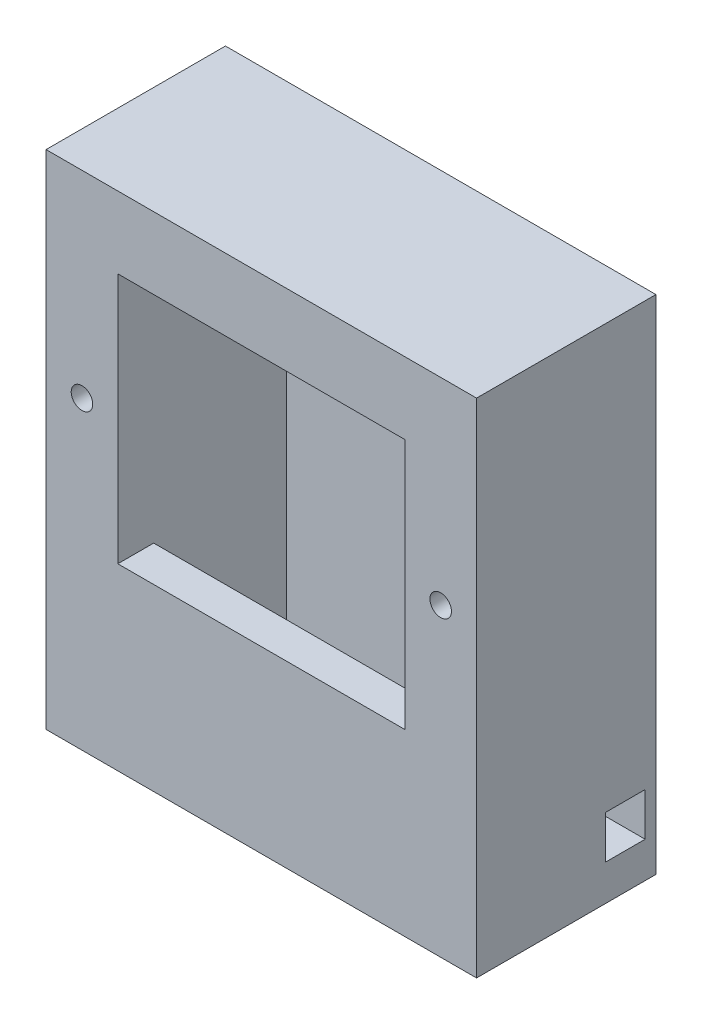
ISO-10303-21;
HEADER;
FILE_DESCRIPTION(('STEP AP214'),'2;1');
FILE_NAME('part.step','',(''),(''),'','','');
FILE_SCHEMA(('AUTOMOTIVE_DESIGN { 1 0 10303 214 1 1 1 1 }'));
ENDSEC;
DATA;
#1=APPLICATION_CONTEXT('core data for automotive mechanical design processes');
#2=APPLICATION_PROTOCOL_DEFINITION('international standard','automotive_design',2000,#1);
#3=PRODUCT_CONTEXT('',#1,'mechanical');
#4=PRODUCT('Part','Part','',(#3));
#5=PRODUCT_RELATED_PRODUCT_CATEGORY('part','',(#4));
#6=PRODUCT_DEFINITION_FORMATION('','',#4);
#7=PRODUCT_DEFINITION_CONTEXT('part definition',#1,'design');
#8=PRODUCT_DEFINITION('design','',#6,#7);
#9=PRODUCT_DEFINITION_SHAPE('','',#8);
#10=(LENGTH_UNIT() NAMED_UNIT(*) SI_UNIT(.MILLI.,.METRE.));
#11=(NAMED_UNIT(*) PLANE_ANGLE_UNIT() SI_UNIT($,.RADIAN.));
#12=(NAMED_UNIT(*) SI_UNIT($,.STERADIAN.) SOLID_ANGLE_UNIT());
#13=UNCERTAINTY_MEASURE_WITH_UNIT(LENGTH_MEASURE(1.E-05),#10,'distance_accuracy_value','');
#14=(GEOMETRIC_REPRESENTATION_CONTEXT(3) GLOBAL_UNCERTAINTY_ASSIGNED_CONTEXT((#13)) GLOBAL_UNIT_ASSIGNED_CONTEXT((#10,
#11,#12)) REPRESENTATION_CONTEXT('',''));
#15=CARTESIAN_POINT('',(0.,0.,0.));
#16=DIRECTION('',(0.,0.,1.));
#17=DIRECTION('',(1.,0.,0.));
#18=AXIS2_PLACEMENT_3D('',#15,#16,#17);
#19=CARTESIAN_POINT('',(0.,0.,50.));
#20=DIRECTION('',(-1.,0.,0.));
#21=DIRECTION('',(0.,-1.,0.));
#22=AXIS2_PLACEMENT_3D('',#19,#20,#21);
#23=PLANE('',#22);
#24=DIRECTION('',(0.,0.,-1.));
#25=VECTOR('',#24,1.);
#26=CARTESIAN_POINT('',(0.,-130.,14.));
#27=LINE('',#26,#25);
#28=CARTESIAN_POINT('',(0.,-130.,14.));
#29=VERTEX_POINT('',#28);
#30=CARTESIAN_POINT('',(0.,-130.,3.));
#31=VERTEX_POINT('',#30);
#32=EDGE_CURVE('E310',#29,#31,#27,.T.);
#33=ORIENTED_EDGE('',*,*,#32,.F.);
#34=DIRECTION('',(0.,-1.,0.));
#35=VECTOR('',#34,1.);
#36=CARTESIAN_POINT('',(0.,-118.,14.));
#37=LINE('',#36,#35);
#38=CARTESIAN_POINT('',(0.,-118.,14.));
#39=VERTEX_POINT('',#38);
#40=EDGE_CURVE('E49',#39,#29,#37,.T.);
#41=ORIENTED_EDGE('',*,*,#40,.F.);
#42=DIRECTION('',(0.,0.,1.));
#43=VECTOR('',#42,1.);
#44=CARTESIAN_POINT('',(0.,-118.,14.));
#45=LINE('',#44,#43);
#46=CARTESIAN_POINT('',(0.,-118.,3.));
#47=VERTEX_POINT('',#46);
#48=EDGE_CURVE('E147',#47,#39,#45,.T.);
#49=ORIENTED_EDGE('',*,*,#48,.F.);
#50=DIRECTION('',(0.,1.,0.));
#51=VECTOR('',#50,1.);
#52=CARTESIAN_POINT('',(0.,-118.,3.));
#53=LINE('',#52,#51);
#54=EDGE_CURVE('E308',#31,#47,#53,.T.);
#55=ORIENTED_EDGE('',*,*,#54,.F.);
#56=EDGE_LOOP('',(#33,#41,#49,#55));
#57=FACE_BOUND('',#56,.T.);
#58=DIRECTION('',(0.,1.,0.));
#59=VECTOR('',#58,1.);
#60=CARTESIAN_POINT('',(0.,0.,0.));
#61=LINE('',#60,#59);
#62=CARTESIAN_POINT('',(0.,-140.,0.));
#63=VERTEX_POINT('',#62);
#64=CARTESIAN_POINT('',(0.,0.,0.));
#65=VERTEX_POINT('',#64);
#66=EDGE_CURVE('E192',#63,#65,#61,.T.);
#67=ORIENTED_EDGE('',*,*,#66,.T.);
#68=DIRECTION('',(0.,0.,-1.));
#69=VECTOR('',#68,1.);
#70=CARTESIAN_POINT('',(0.,0.,50.));
#71=LINE('',#70,#69);
#72=CARTESIAN_POINT('',(0.,0.,50.));
#73=VERTEX_POINT('',#72);
#74=EDGE_CURVE('E11',#73,#65,#71,.T.);
#75=ORIENTED_EDGE('',*,*,#74,.F.);
#76=DIRECTION('',(0.,1.,0.));
#77=VECTOR('',#76,1.);
#78=CARTESIAN_POINT('',(0.,0.,50.));
#79=LINE('',#78,#77);
#80=CARTESIAN_POINT('',(0.,-140.,50.));
#81=VERTEX_POINT('',#80);
#82=EDGE_CURVE('E198',#81,#73,#79,.T.);
#83=ORIENTED_EDGE('',*,*,#82,.F.);
#84=DIRECTION('',(0.,0.,-1.));
#85=VECTOR('',#84,1.);
#86=CARTESIAN_POINT('',(0.,-140.,50.));
#87=LINE('',#86,#85);
#88=EDGE_CURVE('E208',#81,#63,#87,.T.);
#89=ORIENTED_EDGE('',*,*,#88,.T.);
#90=EDGE_LOOP('',(#67,#75,#83,#89));
#91=FACE_BOUND('',#90,.T.);
#92=ADVANCED_FACE('F35',(#57,#91),#23,.F.);
#93=CARTESIAN_POINT('',(0.,0.,50.));
#94=DIRECTION('',(0.,-1.,0.));
#95=DIRECTION('',(0.,0.,-1.));
#96=AXIS2_PLACEMENT_3D('',#93,#94,#95);
#97=PLANE('',#96);
#98=DIRECTION('',(-1.,0.,0.));
#99=VECTOR('',#98,1.);
#100=CARTESIAN_POINT('',(0.,0.,0.));
#101=LINE('',#100,#99);
#102=CARTESIAN_POINT('',(-120.,0.,0.));
#103=VERTEX_POINT('',#102);
#104=EDGE_CURVE('E211',#65,#103,#101,.T.);
#105=ORIENTED_EDGE('',*,*,#104,.T.);
#106=DIRECTION('',(0.,0.,-1.));
#107=VECTOR('',#106,1.);
#108=CARTESIAN_POINT('',(-120.,0.,50.));
#109=LINE('',#108,#107);
#110=CARTESIAN_POINT('',(-120.,0.,50.));
#111=VERTEX_POINT('',#110);
#112=EDGE_CURVE('E42',#111,#103,#109,.T.);
#113=ORIENTED_EDGE('',*,*,#112,.F.);
#114=DIRECTION('',(-1.,0.,0.));
#115=VECTOR('',#114,1.);
#116=CARTESIAN_POINT('',(0.,0.,50.));
#117=LINE('',#116,#115);
#118=EDGE_CURVE('E201',#73,#111,#117,.T.);
#119=ORIENTED_EDGE('',*,*,#118,.F.);
#120=ORIENTED_EDGE('',*,*,#74,.T.);
#121=EDGE_LOOP('',(#105,#113,#119,#120));
#122=FACE_BOUND('',#121,.T.);
#123=ADVANCED_FACE('F241',(#122),#97,.F.);
#124=CARTESIAN_POINT('',(-120.,0.,50.));
#125=DIRECTION('',(1.,0.,0.));
#126=DIRECTION('',(0.,1.,0.));
#127=AXIS2_PLACEMENT_3D('',#124,#125,#126);
#128=PLANE('',#127);
#129=DIRECTION('',(0.,-1.,0.));
#130=VECTOR('',#129,1.);
#131=CARTESIAN_POINT('',(-120.,0.,0.));
#132=LINE('',#131,#130);
#133=CARTESIAN_POINT('',(-120.,-140.,0.));
#134=VERTEX_POINT('',#133);
#135=EDGE_CURVE('E213',#103,#134,#132,.T.);
#136=ORIENTED_EDGE('',*,*,#135,.T.);
#137=DIRECTION('',(0.,0.,-1.));
#138=VECTOR('',#137,1.);
#139=CARTESIAN_POINT('',(-120.,-140.,50.));
#140=LINE('',#139,#138);
#141=CARTESIAN_POINT('',(-120.,-140.,50.));
#142=VERTEX_POINT('',#141);
#143=EDGE_CURVE('E218',#142,#134,#140,.T.);
#144=ORIENTED_EDGE('',*,*,#143,.F.);
#145=DIRECTION('',(0.,-1.,0.));
#146=VECTOR('',#145,1.);
#147=CARTESIAN_POINT('',(-120.,0.,50.));
#148=LINE('',#147,#146);
#149=EDGE_CURVE('E204',#111,#142,#148,.T.);
#150=ORIENTED_EDGE('',*,*,#149,.F.);
#151=ORIENTED_EDGE('',*,*,#112,.T.);
#152=EDGE_LOOP('',(#136,#144,#150,#151));
#153=FACE_BOUND('',#152,.T.);
#154=ADVANCED_FACE('F225',(#153),#128,.F.);
#155=CARTESIAN_POINT('',(0.,-140.,50.));
#156=DIRECTION('',(0.,1.,0.));
#157=DIRECTION('',(-1.,0.,0.));
#158=AXIS2_PLACEMENT_3D('',#155,#156,#157);
#159=PLANE('',#158);
#160=DIRECTION('',(1.,0.,0.));
#161=VECTOR('',#160,1.);
#162=CARTESIAN_POINT('',(0.,-140.,0.));
#163=LINE('',#162,#161);
#164=EDGE_CURVE('E202',#134,#63,#163,.T.);
#165=ORIENTED_EDGE('',*,*,#164,.T.);
#166=ORIENTED_EDGE('',*,*,#88,.F.);
#167=DIRECTION('',(1.,0.,0.));
#168=VECTOR('',#167,1.);
#169=CARTESIAN_POINT('',(0.,-140.,50.));
#170=LINE('',#169,#168);
#171=EDGE_CURVE('E206',#142,#81,#170,.T.);
#172=ORIENTED_EDGE('',*,*,#171,.F.);
#173=ORIENTED_EDGE('',*,*,#143,.T.);
#174=EDGE_LOOP('',(#165,#166,#172,#173));
#175=FACE_BOUND('',#174,.T.);
#176=ADVANCED_FACE('F234',(#175),#159,.F.);
#177=CARTESIAN_POINT('',(0.,0.,50.));
#178=DIRECTION('',(0.,0.,-1.));
#179=DIRECTION('',(-1.,0.,0.));
#180=AXIS2_PLACEMENT_3D('',#177,#178,#179);
#181=PLANE('',#180);
#182=CARTESIAN_POINT('',(-9.99999999999999,-55.,50.));
#183=DIRECTION('',(0.,0.,1.));
#184=DIRECTION('',(1.,0.,0.));
#185=AXIS2_PLACEMENT_3D('',#182,#183,#184);
#186=CIRCLE('',#185,3.);
#187=CARTESIAN_POINT('',(-6.99999999999998,-55.,50.));
#188=VERTEX_POINT('',#187);
#189=EDGE_CURVE('E153',#188,#188,#186,.T.);
#190=ORIENTED_EDGE('',*,*,#189,.F.);
#191=EDGE_LOOP('',(#190));
#192=FACE_BOUND('',#191,.T.);
#193=CARTESIAN_POINT('',(-110.,-55.,50.));
#194=DIRECTION('',(0.,0.,1.));
#195=DIRECTION('',(1.,0.,0.));
#196=AXIS2_PLACEMENT_3D('',#193,#194,#195);
#197=CIRCLE('',#196,3.00000000000001);
#198=CARTESIAN_POINT('',(-107.,-55.,50.));
#199=VERTEX_POINT('',#198);
#200=EDGE_CURVE('E169',#199,#199,#197,.T.);
#201=ORIENTED_EDGE('',*,*,#200,.F.);
#202=EDGE_LOOP('',(#201));
#203=FACE_BOUND('',#202,.T.);
#204=DIRECTION('',(1.,0.,0.));
#205=VECTOR('',#204,1.);
#206=CARTESIAN_POINT('',(-100.,-90.,50.));
#207=LINE('',#206,#205);
#208=CARTESIAN_POINT('',(-100.,-90.,50.));
#209=VERTEX_POINT('',#208);
#210=CARTESIAN_POINT('',(-20.,-90.,50.));
#211=VERTEX_POINT('',#210);
#212=EDGE_CURVE('E183',#209,#211,#207,.T.);
#213=ORIENTED_EDGE('',*,*,#212,.F.);
#214=DIRECTION('',(0.,-1.,0.));
#215=VECTOR('',#214,1.);
#216=CARTESIAN_POINT('',(-100.,-20.,50.));
#217=LINE('',#216,#215);
#218=CARTESIAN_POINT('',(-100.,-20.,50.));
#219=VERTEX_POINT('',#218);
#220=EDGE_CURVE('E168',#219,#209,#217,.T.);
#221=ORIENTED_EDGE('',*,*,#220,.F.);
#222=DIRECTION('',(-1.,0.,0.));
#223=VECTOR('',#222,1.);
#224=CARTESIAN_POINT('',(-100.,-20.,50.));
#225=LINE('',#224,#223);
#226=CARTESIAN_POINT('',(-20.,-20.,50.));
#227=VERTEX_POINT('',#226);
#228=EDGE_CURVE('E177',#227,#219,#225,.T.);
#229=ORIENTED_EDGE('',*,*,#228,.F.);
#230=DIRECTION('',(0.,1.,0.));
#231=VECTOR('',#230,1.);
#232=CARTESIAN_POINT('',(-20.,-20.,50.));
#233=LINE('',#232,#231);
#234=EDGE_CURVE('E185',#211,#227,#233,.T.);
#235=ORIENTED_EDGE('',*,*,#234,.F.);
#236=EDGE_LOOP('',(#213,#221,#229,#235));
#237=FACE_BOUND('',#236,.T.);
#238=ORIENTED_EDGE('',*,*,#82,.T.);
#239=ORIENTED_EDGE('',*,*,#118,.T.);
#240=ORIENTED_EDGE('',*,*,#149,.T.);
#241=ORIENTED_EDGE('',*,*,#171,.T.);
#242=EDGE_LOOP('',(#238,#239,#240,#241));
#243=FACE_BOUND('',#242,.T.);
#244=ADVANCED_FACE('F240',(#192,#203,#237,#243),#181,.F.);
#245=CARTESIAN_POINT('',(0.,0.,0.));
#246=DIRECTION('',(0.,0.,-1.));
#247=DIRECTION('',(-1.,0.,0.));
#248=AXIS2_PLACEMENT_3D('',#245,#246,#247);
#249=PLANE('',#248);
#250=ORIENTED_EDGE('',*,*,#66,.F.);
#251=ORIENTED_EDGE('',*,*,#164,.F.);
#252=ORIENTED_EDGE('',*,*,#135,.F.);
#253=ORIENTED_EDGE('',*,*,#104,.F.);
#254=EDGE_LOOP('',(#250,#251,#252,#253));
#255=FACE_BOUND('',#254,.T.);
#256=ADVANCED_FACE('F231',(#255),#249,.T.);
#257=CARTESIAN_POINT('',(-100.,-20.,3.));
#258=DIRECTION('',(-1.,0.,0.));
#259=DIRECTION('',(0.,-1.,0.));
#260=AXIS2_PLACEMENT_3D('',#257,#258,#259);
#261=PLANE('',#260);
#262=ORIENTED_EDGE('',*,*,#220,.T.);
#263=DIRECTION('',(0.,0.,1.));
#264=VECTOR('',#263,1.);
#265=CARTESIAN_POINT('',(-100.,-90.,3.));
#266=LINE('',#265,#264);
#267=CARTESIAN_POINT('',(-100.,-90.,40.));
#268=VERTEX_POINT('',#267);
#269=EDGE_CURVE('E57',#268,#209,#266,.T.);
#270=ORIENTED_EDGE('',*,*,#269,.F.);
#271=DIRECTION('',(0.,-1.,0.));
#272=VECTOR('',#271,1.);
#273=CARTESIAN_POINT('',(-100.,-90.,40.));
#274=LINE('',#273,#272);
#275=CARTESIAN_POINT('',(-100.,-130.,40.));
#276=VERTEX_POINT('',#275);
#277=EDGE_CURVE('E317',#268,#276,#274,.T.);
#278=ORIENTED_EDGE('',*,*,#277,.T.);
#279=DIRECTION('',(0.,0.,1.));
#280=VECTOR('',#279,1.);
#281=CARTESIAN_POINT('',(-100.,-130.,3.));
#282=LINE('',#281,#280);
#283=CARTESIAN_POINT('',(-100.,-130.,3.));
#284=VERTEX_POINT('',#283);
#285=EDGE_CURVE('E154',#284,#276,#282,.T.);
#286=ORIENTED_EDGE('',*,*,#285,.F.);
#287=DIRECTION('',(0.,-1.,0.));
#288=VECTOR('',#287,1.);
#289=CARTESIAN_POINT('',(-100.,-20.,3.));
#290=LINE('',#289,#288);
#291=CARTESIAN_POINT('',(-100.,-20.,3.));
#292=VERTEX_POINT('',#291);
#293=EDGE_CURVE('E174',#292,#284,#290,.T.);
#294=ORIENTED_EDGE('',*,*,#293,.F.);
#295=DIRECTION('',(0.,0.,1.));
#296=VECTOR('',#295,1.);
#297=CARTESIAN_POINT('',(-100.,-20.,3.));
#298=LINE('',#297,#296);
#299=EDGE_CURVE('E190',#292,#219,#298,.T.);
#300=ORIENTED_EDGE('',*,*,#299,.T.);
#301=EDGE_LOOP('',(#262,#270,#278,#286,#294,#300));
#302=FACE_BOUND('',#301,.T.);
#303=ADVANCED_FACE('F254',(#302),#261,.F.);
#304=CARTESIAN_POINT('',(-100.,-20.,3.));
#305=DIRECTION('',(0.,1.,0.));
#306=DIRECTION('',(0.,0.,1.));
#307=AXIS2_PLACEMENT_3D('',#304,#305,#306);
#308=PLANE('',#307);
#309=ORIENTED_EDGE('',*,*,#228,.T.);
#310=ORIENTED_EDGE('',*,*,#299,.F.);
#311=DIRECTION('',(-1.,0.,0.));
#312=VECTOR('',#311,1.);
#313=CARTESIAN_POINT('',(-100.,-20.,3.));
#314=LINE('',#313,#312);
#315=CARTESIAN_POINT('',(-20.,-20.,3.));
#316=VERTEX_POINT('',#315);
#317=EDGE_CURVE('E179',#316,#292,#314,.T.);
#318=ORIENTED_EDGE('',*,*,#317,.F.);
#319=DIRECTION('',(0.,0.,1.));
#320=VECTOR('',#319,1.);
#321=CARTESIAN_POINT('',(-20.,-20.,3.));
#322=LINE('',#321,#320);
#323=EDGE_CURVE('E193',#316,#227,#322,.T.);
#324=ORIENTED_EDGE('',*,*,#323,.T.);
#325=EDGE_LOOP('',(#309,#310,#318,#324));
#326=FACE_BOUND('',#325,.T.);
#327=ADVANCED_FACE('F260',(#326),#308,.F.);
#328=CARTESIAN_POINT('',(-20.,-20.,3.));
#329=DIRECTION('',(1.,0.,0.));
#330=DIRECTION('',(0.,1.,0.));
#331=AXIS2_PLACEMENT_3D('',#328,#329,#330);
#332=PLANE('',#331);
#333=DIRECTION('',(0.,0.,1.));
#334=VECTOR('',#333,1.);
#335=CARTESIAN_POINT('',(-20.,-118.,14.));
#336=LINE('',#335,#334);
#337=CARTESIAN_POINT('',(-20.,-118.,3.));
#338=VERTEX_POINT('',#337);
#339=CARTESIAN_POINT('',(-20.,-118.,14.));
#340=VERTEX_POINT('',#339);
#341=EDGE_CURVE('E139',#338,#340,#336,.T.);
#342=ORIENTED_EDGE('',*,*,#341,.T.);
#343=DIRECTION('',(0.,-1.,0.));
#344=VECTOR('',#343,1.);
#345=CARTESIAN_POINT('',(-20.,-118.,14.));
#346=LINE('',#345,#344);
#347=CARTESIAN_POINT('',(-20.,-130.,14.));
#348=VERTEX_POINT('',#347);
#349=EDGE_CURVE('E132',#340,#348,#346,.T.);
#350=ORIENTED_EDGE('',*,*,#349,.T.);
#351=DIRECTION('',(0.,0.,1.));
#352=VECTOR('',#351,1.);
#353=CARTESIAN_POINT('',(-20.,-130.,3.));
#354=LINE('',#353,#352);
#355=CARTESIAN_POINT('',(-20.,-130.,40.));
#356=VERTEX_POINT('',#355);
#357=EDGE_CURVE('E143',#348,#356,#354,.T.);
#358=ORIENTED_EDGE('',*,*,#357,.T.);
#359=DIRECTION('',(0.,1.,0.));
#360=VECTOR('',#359,1.);
#361=CARTESIAN_POINT('',(-20.,-90.,40.));
#362=LINE('',#361,#360);
#363=CARTESIAN_POINT('',(-20.,-90.,40.));
#364=VERTEX_POINT('',#363);
#365=EDGE_CURVE('E322',#356,#364,#362,.T.);
#366=ORIENTED_EDGE('',*,*,#365,.T.);
#367=DIRECTION('',(0.,0.,1.));
#368=VECTOR('',#367,1.);
#369=CARTESIAN_POINT('',(-20.,-90.,3.));
#370=LINE('',#369,#368);
#371=EDGE_CURVE('E195',#364,#211,#370,.T.);
#372=ORIENTED_EDGE('',*,*,#371,.T.);
#373=ORIENTED_EDGE('',*,*,#234,.T.);
#374=ORIENTED_EDGE('',*,*,#323,.F.);
#375=DIRECTION('',(0.,1.,0.));
#376=VECTOR('',#375,1.);
#377=CARTESIAN_POINT('',(-20.,-20.,3.));
#378=LINE('',#377,#376);
#379=EDGE_CURVE('E176',#338,#316,#378,.T.);
#380=ORIENTED_EDGE('',*,*,#379,.F.);
#381=EDGE_LOOP('',(#342,#350,#358,#366,#372,#373,#374,#380));
#382=FACE_BOUND('',#381,.T.);
#383=ADVANCED_FACE('F142',(#382),#332,.F.);
#384=CARTESIAN_POINT('',(-100.,-90.,3.));
#385=DIRECTION('',(0.,-1.,0.));
#386=DIRECTION('',(0.,0.,-1.));
#387=AXIS2_PLACEMENT_3D('',#384,#385,#386);
#388=PLANE('',#387);
#389=ORIENTED_EDGE('',*,*,#371,.F.);
#390=DIRECTION('',(-1.,0.,0.));
#391=VECTOR('',#390,1.);
#392=CARTESIAN_POINT('',(-100.,-90.,40.));
#393=LINE('',#392,#391);
#394=EDGE_CURVE('E162',#364,#268,#393,.T.);
#395=ORIENTED_EDGE('',*,*,#394,.T.);
#396=ORIENTED_EDGE('',*,*,#269,.T.);
#397=ORIENTED_EDGE('',*,*,#212,.T.);
#398=EDGE_LOOP('',(#389,#395,#396,#397));
#399=FACE_BOUND('',#398,.T.);
#400=ADVANCED_FACE('F262',(#399),#388,.F.);
#401=CARTESIAN_POINT('',(0.,0.,3.));
#402=DIRECTION('',(0.,0.,1.));
#403=DIRECTION('',(1.,0.,0.));
#404=AXIS2_PLACEMENT_3D('',#401,#402,#403);
#405=PLANE('',#404);
#406=ORIENTED_EDGE('',*,*,#293,.T.);
#407=DIRECTION('',(1.,0.,0.));
#408=VECTOR('',#407,1.);
#409=CARTESIAN_POINT('',(-100.,-130.,3.));
#410=LINE('',#409,#408);
#411=EDGE_CURVE('E159',#284,#31,#410,.T.);
#412=ORIENTED_EDGE('',*,*,#411,.T.);
#413=ORIENTED_EDGE('',*,*,#54,.T.);
#414=DIRECTION('',(1.,0.,0.));
#415=VECTOR('',#414,1.);
#416=CARTESIAN_POINT('',(-20.,-118.,3.));
#417=LINE('',#416,#415);
#418=EDGE_CURVE('E138',#338,#47,#417,.T.);
#419=ORIENTED_EDGE('',*,*,#418,.F.);
#420=ORIENTED_EDGE('',*,*,#379,.T.);
#421=ORIENTED_EDGE('',*,*,#317,.T.);
#422=EDGE_LOOP('',(#406,#412,#413,#419,#420,#421));
#423=FACE_BOUND('',#422,.T.);
#424=ADVANCED_FACE('F265',(#423),#405,.T.);
#425=CARTESIAN_POINT('',(-110.,-55.,3.));
#426=DIRECTION('',(0.,0.,1.));
#427=DIRECTION('',(1.,0.,0.));
#428=AXIS2_PLACEMENT_3D('',#425,#426,#427);
#429=CYLINDRICAL_SURFACE('',#428,3.00000000000001);
#430=CARTESIAN_POINT('',(-110.,-55.,3.));
#431=DIRECTION('',(0.,0.,1.));
#432=DIRECTION('',(1.,0.,0.));
#433=AXIS2_PLACEMENT_3D('',#430,#431,#432);
#434=CIRCLE('',#433,3.00000000000001);
#435=CARTESIAN_POINT('',(-107.,-55.,3.));
#436=VERTEX_POINT('',#435);
#437=EDGE_CURVE('E165',#436,#436,#434,.T.);
#438=ORIENTED_EDGE('',*,*,#437,.F.);
#439=EDGE_LOOP('',(#438));
#440=FACE_BOUND('',#439,.T.);
#441=ORIENTED_EDGE('',*,*,#200,.T.);
#442=EDGE_LOOP('',(#441));
#443=FACE_BOUND('',#442,.T.);
#444=ADVANCED_FACE('F273',(#440,#443),#429,.F.);
#445=CARTESIAN_POINT('',(-110.,-55.,3.));
#446=DIRECTION('',(0.,0.,1.));
#447=DIRECTION('',(1.,0.,0.));
#448=AXIS2_PLACEMENT_3D('',#445,#446,#447);
#449=PLANE('',#448);
#450=ORIENTED_EDGE('',*,*,#437,.T.);
#451=EDGE_LOOP('',(#450));
#452=FACE_BOUND('',#451,.T.);
#453=ADVANCED_FACE('F279',(#452),#449,.T.);
#454=CARTESIAN_POINT('',(-9.99999999999999,-55.,3.));
#455=DIRECTION('',(0.,0.,1.));
#456=DIRECTION('',(1.,0.,0.));
#457=AXIS2_PLACEMENT_3D('',#454,#455,#456);
#458=CYLINDRICAL_SURFACE('',#457,3.);
#459=CARTESIAN_POINT('',(-9.99999999999999,-55.,3.));
#460=DIRECTION('',(0.,0.,1.));
#461=DIRECTION('',(1.,0.,0.));
#462=AXIS2_PLACEMENT_3D('',#459,#460,#461);
#463=CIRCLE('',#462,3.);
#464=CARTESIAN_POINT('',(-6.99999999999998,-55.,3.));
#465=VERTEX_POINT('',#464);
#466=EDGE_CURVE('E157',#465,#465,#463,.T.);
#467=ORIENTED_EDGE('',*,*,#466,.F.);
#468=EDGE_LOOP('',(#467));
#469=FACE_BOUND('',#468,.T.);
#470=ORIENTED_EDGE('',*,*,#189,.T.);
#471=EDGE_LOOP('',(#470));
#472=FACE_BOUND('',#471,.T.);
#473=ADVANCED_FACE('F275',(#469,#472),#458,.F.);
#474=CARTESIAN_POINT('',(-9.99999999999999,-55.,3.));
#475=DIRECTION('',(0.,0.,1.));
#476=DIRECTION('',(1.,0.,0.));
#477=AXIS2_PLACEMENT_3D('',#474,#475,#476);
#478=PLANE('',#477);
#479=ORIENTED_EDGE('',*,*,#466,.T.);
#480=EDGE_LOOP('',(#479));
#481=FACE_BOUND('',#480,.T.);
#482=ADVANCED_FACE('F278',(#481),#478,.T.);
#483=CARTESIAN_POINT('',(-100.,-130.,3.));
#484=DIRECTION('',(0.,-1.,0.));
#485=DIRECTION('',(0.,0.,-1.));
#486=AXIS2_PLACEMENT_3D('',#483,#484,#485);
#487=PLANE('',#486);
#488=DIRECTION('',(1.,0.,0.));
#489=VECTOR('',#488,1.);
#490=CARTESIAN_POINT('',(-100.,-130.,40.));
#491=LINE('',#490,#489);
#492=EDGE_CURVE('E152',#276,#356,#491,.T.);
#493=ORIENTED_EDGE('',*,*,#492,.T.);
#494=ORIENTED_EDGE('',*,*,#357,.F.);
#495=DIRECTION('',(1.,0.,0.));
#496=VECTOR('',#495,1.);
#497=CARTESIAN_POINT('',(-20.,-130.,14.));
#498=LINE('',#497,#496);
#499=EDGE_CURVE('E129',#348,#29,#498,.T.);
#500=ORIENTED_EDGE('',*,*,#499,.T.);
#501=ORIENTED_EDGE('',*,*,#32,.T.);
#502=ORIENTED_EDGE('',*,*,#411,.F.);
#503=ORIENTED_EDGE('',*,*,#285,.T.);
#504=EDGE_LOOP('',(#493,#494,#500,#501,#502,#503));
#505=FACE_BOUND('',#504,.T.);
#506=ADVANCED_FACE('F150',(#505),#487,.F.);
#507=CARTESIAN_POINT('',(0.,0.,40.));
#508=DIRECTION('',(0.,0.,1.));
#509=DIRECTION('',(1.,0.,0.));
#510=AXIS2_PLACEMENT_3D('',#507,#508,#509);
#511=PLANE('',#510);
#512=ORIENTED_EDGE('',*,*,#277,.F.);
#513=ORIENTED_EDGE('',*,*,#394,.F.);
#514=ORIENTED_EDGE('',*,*,#365,.F.);
#515=ORIENTED_EDGE('',*,*,#492,.F.);
#516=EDGE_LOOP('',(#512,#513,#514,#515));
#517=FACE_BOUND('',#516,.T.);
#518=ADVANCED_FACE('F292',(#517),#511,.F.);
#519=CARTESIAN_POINT('',(-20.,-118.,14.));
#520=DIRECTION('',(0.,0.,1.));
#521=DIRECTION('',(0.,-1.,0.));
#522=AXIS2_PLACEMENT_3D('',#519,#520,#521);
#523=PLANE('',#522);
#524=ORIENTED_EDGE('',*,*,#40,.T.);
#525=ORIENTED_EDGE('',*,*,#499,.F.);
#526=ORIENTED_EDGE('',*,*,#349,.F.);
#527=DIRECTION('',(1.,0.,0.));
#528=VECTOR('',#527,1.);
#529=CARTESIAN_POINT('',(-20.,-118.,14.));
#530=LINE('',#529,#528);
#531=EDGE_CURVE('E305',#340,#39,#530,.T.);
#532=ORIENTED_EDGE('',*,*,#531,.T.);
#533=EDGE_LOOP('',(#524,#525,#526,#532));
#534=FACE_BOUND('',#533,.T.);
#535=ADVANCED_FACE('F131',(#534),#523,.F.);
#536=CARTESIAN_POINT('',(-20.,-118.,14.));
#537=DIRECTION('',(0.,1.,0.));
#538=DIRECTION('',(-1.,0.,0.));
#539=AXIS2_PLACEMENT_3D('',#536,#537,#538);
#540=PLANE('',#539);
#541=ORIENTED_EDGE('',*,*,#48,.T.);
#542=ORIENTED_EDGE('',*,*,#531,.F.);
#543=ORIENTED_EDGE('',*,*,#341,.F.);
#544=ORIENTED_EDGE('',*,*,#418,.T.);
#545=EDGE_LOOP('',(#541,#542,#543,#544));
#546=FACE_BOUND('',#545,.T.);
#547=ADVANCED_FACE('F298',(#546),#540,.F.);
#548=CLOSED_SHELL('',(#92,#123,#154,#176,#244,#256,#303,#327,#383,#400,#424,#444,#453,#473,#482,
#506,#518,#535,#547));
#549=MANIFOLD_SOLID_BREP('B2',#548);
#550=ADVANCED_BREP_SHAPE_REPRESENTATION('',(#18,#549),#14);
#551=SHAPE_DEFINITION_REPRESENTATION(#9,#550);
ENDSEC;
END-ISO-10303-21;
